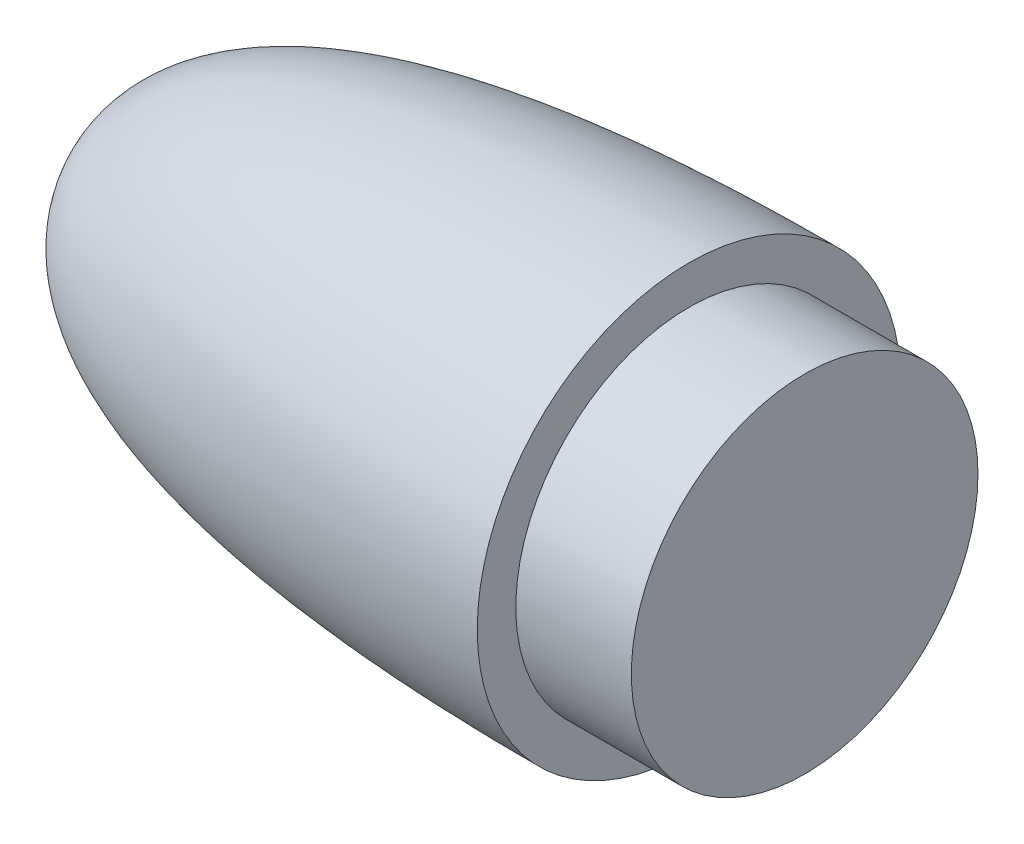
ISO-10303-21;
HEADER;
FILE_DESCRIPTION(('STEP AP214'),'2;1');
FILE_NAME('part.step','',(''),(''),'','','');
FILE_SCHEMA(('AUTOMOTIVE_DESIGN { 1 0 10303 214 1 1 1 1 }'));
ENDSEC;
DATA;
#1=APPLICATION_CONTEXT('core data for automotive mechanical design processes');
#2=APPLICATION_PROTOCOL_DEFINITION('international standard','automotive_design',2000,#1);
#3=PRODUCT_CONTEXT('',#1,'mechanical');
#4=PRODUCT('Part','Part','',(#3));
#5=PRODUCT_RELATED_PRODUCT_CATEGORY('part','',(#4));
#6=PRODUCT_DEFINITION_FORMATION('','',#4);
#7=PRODUCT_DEFINITION_CONTEXT('part definition',#1,'design');
#8=PRODUCT_DEFINITION('design','',#6,#7);
#9=PRODUCT_DEFINITION_SHAPE('','',#8);
#10=(LENGTH_UNIT() NAMED_UNIT(*) SI_UNIT(.MILLI.,.METRE.));
#11=(NAMED_UNIT(*) PLANE_ANGLE_UNIT() SI_UNIT($,.RADIAN.));
#12=(NAMED_UNIT(*) SI_UNIT($,.STERADIAN.) SOLID_ANGLE_UNIT());
#13=UNCERTAINTY_MEASURE_WITH_UNIT(LENGTH_MEASURE(1.E-05),#10,'distance_accuracy_value','');
#14=(GEOMETRIC_REPRESENTATION_CONTEXT(3) GLOBAL_UNCERTAINTY_ASSIGNED_CONTEXT((#13)) GLOBAL_UNIT_ASSIGNED_CONTEXT((#10,
#11,#12)) REPRESENTATION_CONTEXT('',''));
#15=CARTESIAN_POINT('',(0.,0.,0.));
#16=DIRECTION('',(0.,0.,1.));
#17=DIRECTION('',(1.,0.,0.));
#18=AXIS2_PLACEMENT_3D('',#15,#16,#17);
#19=CARTESIAN_POINT('',(-15.,0.,0.));
#20=DIRECTION('',(1.,0.,0.));
#21=DIRECTION('',(0.,0.,-1.));
#22=AXIS2_PLACEMENT_3D('',#19,#20,#21);
#23=PLANE('',#22);
#24=CARTESIAN_POINT('',(-15.,0.,-22.5));
#25=DIRECTION('',(1.,0.,0.));
#26=DIRECTION('',(0.,0.,-1.));
#27=AXIS2_PLACEMENT_3D('',#24,#25,#26);
#28=CIRCLE('',#27,27.5);
#29=CARTESIAN_POINT('',(-15.,0.,-50.));
#30=VERTEX_POINT('',#29);
#31=EDGE_CURVE('E11',#30,#30,#28,.T.);
#32=ORIENTED_EDGE('',*,*,#31,.T.);
#33=EDGE_LOOP('',(#32));
#34=FACE_BOUND('',#33,.T.);
#35=CARTESIAN_POINT('',(-15.,0.,-22.5));
#36=DIRECTION('',(1.,0.,0.));
#37=DIRECTION('',(0.,0.,-1.));
#38=AXIS2_PLACEMENT_3D('',#35,#36,#37);
#39=CIRCLE('',#38,22.5);
#40=CARTESIAN_POINT('',(-15.,0.,-45.));
#41=VERTEX_POINT('',#40);
#42=EDGE_CURVE('E60',#41,#41,#39,.T.);
#43=ORIENTED_EDGE('',*,*,#42,.F.);
#44=EDGE_LOOP('',(#43));
#45=FACE_BOUND('',#44,.T.);
#46=ADVANCED_FACE('F36',(#34,#45),#23,.T.);
#47=CARTESIAN_POINT('',(-15.,0.,-50.));
#48=CARTESIAN_POINT('',(-91.2,0.,-50.));
#49=CARTESIAN_POINT('',(-91.2,0.,-22.5));
#50=B_SPLINE_CURVE_WITH_KNOTS('',2,(#47,#48,#49),.UNSPECIFIED.,.F.,.F.,(3,3),(0.,1.),.UNSPECIFIED.);
#51=CARTESIAN_POINT('',(-15.,0.,-22.5));
#52=DIRECTION('',(1.,0.,0.));
#53=AXIS1_PLACEMENT('',#51,#52);
#54=SURFACE_OF_REVOLUTION('',#50,#53);
#55=CARTESIAN_POINT('',(-91.2,0.,-22.5));
#56=VERTEX_POINT('',#55);
#57=VERTEX_LOOP('',#56);
#58=FACE_BOUND('',#57,.T.);
#59=ORIENTED_EDGE('',*,*,#31,.F.);
#60=EDGE_LOOP('',(#59));
#61=FACE_BOUND('',#60,.T.);
#62=ADVANCED_FACE('F50',(#58,#61),#54,.F.);
#63=CARTESIAN_POINT('',(0.,0.,0.));
#64=DIRECTION('',(1.,0.,0.));
#65=DIRECTION('',(0.,0.,-1.));
#66=AXIS2_PLACEMENT_3D('',#63,#64,#65);
#67=PLANE('',#66);
#68=CARTESIAN_POINT('',(0.,0.,-22.5));
#69=DIRECTION('',(1.,0.,0.));
#70=DIRECTION('',(0.,0.,-1.));
#71=AXIS2_PLACEMENT_3D('',#68,#69,#70);
#72=CIRCLE('',#71,22.5);
#73=CARTESIAN_POINT('',(0.,0.,-45.));
#74=VERTEX_POINT('',#73);
#75=EDGE_CURVE('E42',#74,#74,#72,.T.);
#76=ORIENTED_EDGE('',*,*,#75,.T.);
#77=EDGE_LOOP('',(#76));
#78=FACE_BOUND('',#77,.T.);
#79=ADVANCED_FACE('F49',(#78),#67,.T.);
#80=CARTESIAN_POINT('',(-15.,0.,-22.5));
#81=DIRECTION('',(1.,0.,0.));
#82=DIRECTION('',(0.,0.,-1.));
#83=AXIS2_PLACEMENT_3D('',#80,#81,#82);
#84=CYLINDRICAL_SURFACE('',#83,22.5);
#85=ORIENTED_EDGE('',*,*,#42,.T.);
#86=EDGE_LOOP('',(#85));
#87=FACE_BOUND('',#86,.T.);
#88=ORIENTED_EDGE('',*,*,#75,.F.);
#89=EDGE_LOOP('',(#88));
#90=FACE_BOUND('',#89,.T.);
#91=ADVANCED_FACE('F73',(#87,#90),#84,.T.);
#92=CLOSED_SHELL('',(#46,#62,#79,#91));
#93=MANIFOLD_SOLID_BREP('B2',#92);
#94=ADVANCED_BREP_SHAPE_REPRESENTATION('',(#18,#93),#14);
#95=SHAPE_DEFINITION_REPRESENTATION(#9,#94);
ENDSEC;
END-ISO-10303-21;
